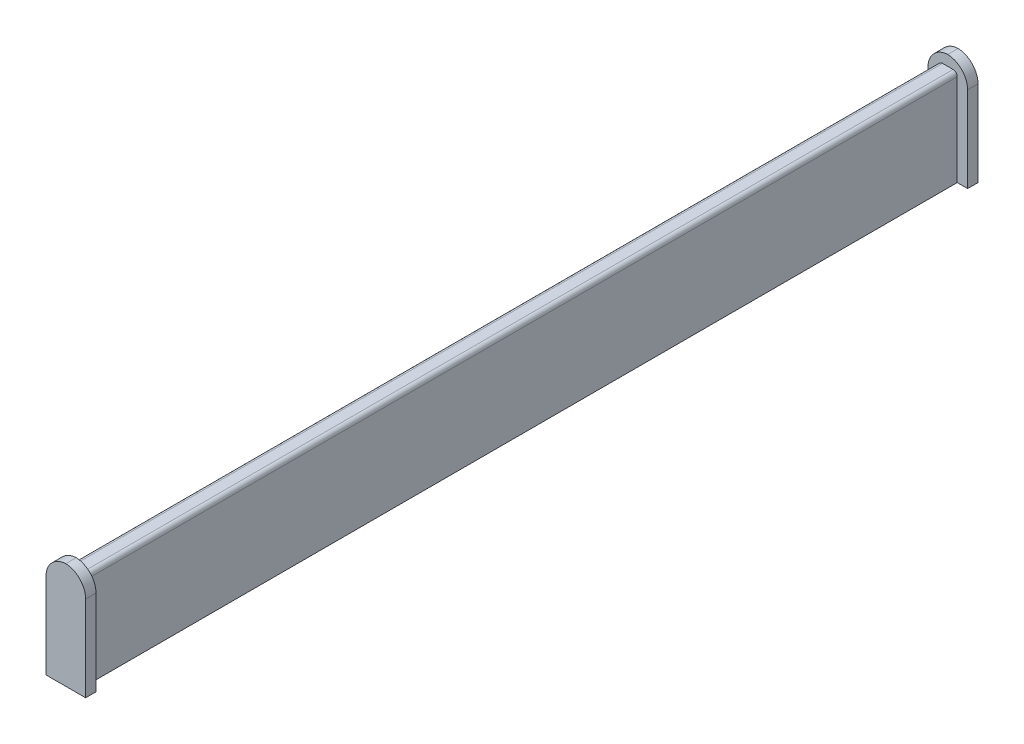
ISO-10303-21;
HEADER;
FILE_DESCRIPTION(('STEP AP214'),'2;1');
FILE_NAME('part.step','',(''),(''),'','','');
FILE_SCHEMA(('AUTOMOTIVE_DESIGN { 1 0 10303 214 1 1 1 1 }'));
ENDSEC;
DATA;
#1=APPLICATION_CONTEXT('core data for automotive mechanical design processes');
#2=APPLICATION_PROTOCOL_DEFINITION('international standard','automotive_design',2000,#1);
#3=PRODUCT_CONTEXT('',#1,'mechanical');
#4=PRODUCT('Part','Part','',(#3));
#5=PRODUCT_RELATED_PRODUCT_CATEGORY('part','',(#4));
#6=PRODUCT_DEFINITION_FORMATION('','',#4);
#7=PRODUCT_DEFINITION_CONTEXT('part definition',#1,'design');
#8=PRODUCT_DEFINITION('design','',#6,#7);
#9=PRODUCT_DEFINITION_SHAPE('','',#8);
#10=(LENGTH_UNIT() NAMED_UNIT(*) SI_UNIT(.MILLI.,.METRE.));
#11=(NAMED_UNIT(*) PLANE_ANGLE_UNIT() SI_UNIT($,.RADIAN.));
#12=(NAMED_UNIT(*) SI_UNIT($,.STERADIAN.) SOLID_ANGLE_UNIT());
#13=UNCERTAINTY_MEASURE_WITH_UNIT(LENGTH_MEASURE(1.E-05),#10,'distance_accuracy_value','');
#14=(GEOMETRIC_REPRESENTATION_CONTEXT(3) GLOBAL_UNCERTAINTY_ASSIGNED_CONTEXT((#13)) GLOBAL_UNIT_ASSIGNED_CONTEXT((#10,
#11,#12)) REPRESENTATION_CONTEXT('',''));
#15=CARTESIAN_POINT('',(0.,0.,0.));
#16=DIRECTION('',(0.,0.,1.));
#17=DIRECTION('',(1.,0.,0.));
#18=AXIS2_PLACEMENT_3D('',#15,#16,#17);
#19=CARTESIAN_POINT('',(3.032125,1.905,133.35));
#20=DIRECTION('',(1.,0.,0.));
#21=DIRECTION('',(0.,0.,-1.));
#22=AXIS2_PLACEMENT_3D('',#19,#20,#21);
#23=PLANE('',#22);
#24=DIRECTION('',(0.,-1.,0.));
#25=VECTOR('',#24,1.);
#26=CARTESIAN_POINT('',(3.032125,1.905,0.));
#27=LINE('',#26,#25);
#28=CARTESIAN_POINT('',(3.032125,3.032125,0.));
#29=VERTEX_POINT('',#28);
#30=CARTESIAN_POINT('',(3.032125,-11.007125052,0.));
#31=VERTEX_POINT('',#30);
#32=EDGE_CURVE('E226',#29,#31,#27,.T.);
#33=ORIENTED_EDGE('',*,*,#32,.F.);
#34=DIRECTION('',(0.,0.,-1.));
#35=VECTOR('',#34,1.);
#36=CARTESIAN_POINT('',(3.032125,3.032125,133.35));
#37=LINE('',#36,#35);
#38=CARTESIAN_POINT('',(3.032125,3.032125,133.35));
#39=VERTEX_POINT('',#38);
#40=EDGE_CURVE('E52',#29,#39,#37,.F.);
#41=ORIENTED_EDGE('',*,*,#40,.T.);
#42=DIRECTION('',(0.,-1.,0.));
#43=VECTOR('',#42,1.);
#44=CARTESIAN_POINT('',(3.032125,3.667125,133.35));
#45=LINE('',#44,#43);
#46=CARTESIAN_POINT('',(3.032125,-11.007125052,133.35));
#47=VERTEX_POINT('',#46);
#48=EDGE_CURVE('E229',#39,#47,#45,.T.);
#49=ORIENTED_EDGE('',*,*,#48,.T.);
#50=DIRECTION('',(0.,0.,1.));
#51=VECTOR('',#50,1.);
#52=CARTESIAN_POINT('',(3.032125,-11.007125052,133.35));
#53=LINE('',#52,#51);
#54=EDGE_CURVE('E194',#31,#47,#53,.T.);
#55=ORIENTED_EDGE('',*,*,#54,.F.);
#56=EDGE_LOOP('',(#33,#41,#49,#55));
#57=FACE_BOUND('',#56,.T.);
#58=ADVANCED_FACE('F37',(#57),#23,.T.);
#59=CARTESIAN_POINT('',(0.142874999999999,3.667125,133.35));
#60=DIRECTION('',(0.,1.,0.));
#61=DIRECTION('',(0.,0.,1.));
#62=AXIS2_PLACEMENT_3D('',#59,#60,#61);
#63=PLANE('',#62);
#64=DIRECTION('',(1.,0.,0.));
#65=VECTOR('',#64,1.);
#66=CARTESIAN_POINT('',(0.142874999999999,3.667125,0.));
#67=LINE('',#66,#65);
#68=CARTESIAN_POINT('',(0.777874999999999,3.667125,0.));
#69=VERTEX_POINT('',#68);
#70=CARTESIAN_POINT('',(2.397125,3.667125,0.));
#71=VERTEX_POINT('',#70);
#72=EDGE_CURVE('E232',#69,#71,#67,.T.);
#73=ORIENTED_EDGE('',*,*,#72,.F.);
#74=DIRECTION('',(0.,0.,-1.));
#75=VECTOR('',#74,1.);
#76=CARTESIAN_POINT('',(0.777874999999999,3.667125,133.35));
#77=LINE('',#76,#75);
#78=CARTESIAN_POINT('',(0.777874999999999,3.667125,133.35));
#79=VERTEX_POINT('',#78);
#80=EDGE_CURVE('E269',#69,#79,#77,.F.);
#81=ORIENTED_EDGE('',*,*,#80,.T.);
#82=DIRECTION('',(1.,0.,0.));
#83=VECTOR('',#82,1.);
#84=CARTESIAN_POINT('',(0.142874999999999,3.667125,133.35));
#85=LINE('',#84,#83);
#86=CARTESIAN_POINT('',(2.397125,3.667125,133.35));
#87=VERTEX_POINT('',#86);
#88=EDGE_CURVE('E225',#79,#87,#85,.T.);
#89=ORIENTED_EDGE('',*,*,#88,.T.);
#90=DIRECTION('',(0.,0.,-1.));
#91=VECTOR('',#90,1.);
#92=CARTESIAN_POINT('',(2.397125,3.667125,133.35));
#93=LINE('',#92,#91);
#94=EDGE_CURVE('E266',#87,#71,#93,.T.);
#95=ORIENTED_EDGE('',*,*,#94,.T.);
#96=EDGE_LOOP('',(#73,#81,#89,#95));
#97=FACE_BOUND('',#96,.T.);
#98=ADVANCED_FACE('F288',(#97),#63,.T.);
#99=CARTESIAN_POINT('',(0.142874999999999,3.667125,133.35));
#100=DIRECTION('',(1.,0.,0.));
#101=DIRECTION('',(0.,1.,0.));
#102=AXIS2_PLACEMENT_3D('',#99,#100,#101);
#103=PLANE('',#102);
#104=DIRECTION('',(0.,1.,0.));
#105=VECTOR('',#104,1.);
#106=CARTESIAN_POINT('',(0.142875,0.142875,133.35));
#107=LINE('',#106,#105);
#108=CARTESIAN_POINT('',(0.142875000000001,-11.007125052,133.35));
#109=VERTEX_POINT('',#108);
#110=CARTESIAN_POINT('',(0.142874999999999,3.032125,133.35));
#111=VERTEX_POINT('',#110);
#112=EDGE_CURVE('E165',#109,#111,#107,.T.);
#113=ORIENTED_EDGE('',*,*,#112,.T.);
#114=DIRECTION('',(0.,0.,-1.));
#115=VECTOR('',#114,1.);
#116=CARTESIAN_POINT('',(0.142874999999999,3.032125,0.));
#117=LINE('',#116,#115);
#118=CARTESIAN_POINT('',(0.142874999999999,3.032125,0.));
#119=VERTEX_POINT('',#118);
#120=EDGE_CURVE('E261',#111,#119,#117,.T.);
#121=ORIENTED_EDGE('',*,*,#120,.T.);
#122=DIRECTION('',(0.,-1.,0.));
#123=VECTOR('',#122,1.);
#124=CARTESIAN_POINT('',(0.142874999999999,3.667125,0.));
#125=LINE('',#124,#123);
#126=CARTESIAN_POINT('',(0.142875000000001,-11.007125052,0.));
#127=VERTEX_POINT('',#126);
#128=EDGE_CURVE('E221',#119,#127,#125,.T.);
#129=ORIENTED_EDGE('',*,*,#128,.T.);
#130=DIRECTION('',(0.,0.,-1.));
#131=VECTOR('',#130,1.);
#132=CARTESIAN_POINT('',(0.142875000000001,-11.007125052,0.));
#133=LINE('',#132,#131);
#134=EDGE_CURVE('E169',#109,#127,#133,.T.);
#135=ORIENTED_EDGE('',*,*,#134,.F.);
#136=EDGE_LOOP('',(#113,#121,#129,#135));
#137=FACE_BOUND('',#136,.T.);
#138=ADVANCED_FACE('F281',(#137),#103,.F.);
#139=CARTESIAN_POINT('',(-1.444625,0.142875,134.9375));
#140=DIRECTION('',(-1.,0.,0.));
#141=DIRECTION('',(0.,0.,1.));
#142=AXIS2_PLACEMENT_3D('',#139,#140,#141);
#143=PLANE('',#142);
#144=DIRECTION('',(0.,1.,0.));
#145=VECTOR('',#144,1.);
#146=CARTESIAN_POINT('',(-1.444625,0.142875,134.9375));
#147=LINE('',#146,#145);
#148=CARTESIAN_POINT('',(-1.444625,-11.007125052,134.9375));
#149=VERTEX_POINT('',#148);
#150=CARTESIAN_POINT('',(-1.444625,2.079625,134.9375));
#151=VERTEX_POINT('',#150);
#152=EDGE_CURVE('E219',#149,#151,#147,.T.);
#153=ORIENTED_EDGE('',*,*,#152,.T.);
#154=DIRECTION('',(0.,0.,-1.));
#155=VECTOR('',#154,1.);
#156=CARTESIAN_POINT('',(-1.444625,2.079625,134.9375));
#157=LINE('',#156,#155);
#158=CARTESIAN_POINT('',(-1.444625,2.079625,133.35));
#159=VERTEX_POINT('',#158);
#160=EDGE_CURVE('E156',#151,#159,#157,.T.);
#161=ORIENTED_EDGE('',*,*,#160,.T.);
#162=DIRECTION('',(0.,1.,0.));
#163=VECTOR('',#162,1.);
#164=CARTESIAN_POINT('',(-1.444625,0.142875,133.35));
#165=LINE('',#164,#163);
#166=CARTESIAN_POINT('',(-1.444625,-11.007125052,133.35));
#167=VERTEX_POINT('',#166);
#168=EDGE_CURVE('E149',#167,#159,#165,.T.);
#169=ORIENTED_EDGE('',*,*,#168,.F.);
#170=DIRECTION('',(0.,0.,-1.));
#171=VECTOR('',#170,1.);
#172=CARTESIAN_POINT('',(-1.444625,-11.007125052,133.35));
#173=LINE('',#172,#171);
#174=EDGE_CURVE('E154',#149,#167,#173,.T.);
#175=ORIENTED_EDGE('',*,*,#174,.F.);
#176=EDGE_LOOP('',(#153,#161,#169,#175));
#177=FACE_BOUND('',#176,.T.);
#178=ADVANCED_FACE('F152',(#177),#143,.T.);
#179=CARTESIAN_POINT('',(4.619625,0.142875,134.9375));
#180=DIRECTION('',(-1.,0.,0.));
#181=DIRECTION('',(0.,0.,1.));
#182=AXIS2_PLACEMENT_3D('',#179,#180,#181);
#183=PLANE('',#182);
#184=DIRECTION('',(0.,1.,0.));
#185=VECTOR('',#184,1.);
#186=CARTESIAN_POINT('',(4.619625,0.142875,133.35));
#187=LINE('',#186,#185);
#188=CARTESIAN_POINT('',(4.619625,-11.007125052,133.35));
#189=VERTEX_POINT('',#188);
#190=CARTESIAN_POINT('',(4.619625,2.079625,133.35));
#191=VERTEX_POINT('',#190);
#192=EDGE_CURVE('E159',#189,#191,#187,.T.);
#193=ORIENTED_EDGE('',*,*,#192,.T.);
#194=DIRECTION('',(0.,0.,-1.));
#195=VECTOR('',#194,1.);
#196=CARTESIAN_POINT('',(4.619625,2.079625,134.9375));
#197=LINE('',#196,#195);
#198=CARTESIAN_POINT('',(4.619625,2.079625,134.9375));
#199=VERTEX_POINT('',#198);
#200=EDGE_CURVE('E244',#191,#199,#197,.F.);
#201=ORIENTED_EDGE('',*,*,#200,.T.);
#202=DIRECTION('',(0.,1.,0.));
#203=VECTOR('',#202,1.);
#204=CARTESIAN_POINT('',(4.619625,0.142875,134.9375));
#205=LINE('',#204,#203);
#206=CARTESIAN_POINT('',(4.619625,-11.007125052,134.9375));
#207=VERTEX_POINT('',#206);
#208=EDGE_CURVE('E158',#207,#199,#205,.T.);
#209=ORIENTED_EDGE('',*,*,#208,.F.);
#210=DIRECTION('',(0.,0.,1.));
#211=VECTOR('',#210,1.);
#212=CARTESIAN_POINT('',(4.619625,-11.007125052,134.9375));
#213=LINE('',#212,#211);
#214=EDGE_CURVE('E200',#189,#207,#213,.T.);
#215=ORIENTED_EDGE('',*,*,#214,.F.);
#216=EDGE_LOOP('',(#193,#201,#209,#215));
#217=FACE_BOUND('',#216,.T.);
#218=ADVANCED_FACE('F337',(#217),#183,.F.);
#219=CARTESIAN_POINT('',(0.,0.,134.9375));
#220=DIRECTION('',(0.,0.,1.));
#221=DIRECTION('',(1.,0.,0.));
#222=AXIS2_PLACEMENT_3D('',#219,#220,#221);
#223=PLANE('',#222);
#224=CARTESIAN_POINT('',(1.444625,2.079625,134.9375));
#225=DIRECTION('',(0.,0.,1.));
#226=DIRECTION('',(1.,0.,0.));
#227=AXIS2_PLACEMENT_3D('',#224,#225,#226);
#228=CIRCLE('',#227,3.175);
#229=CARTESIAN_POINT('',(1.5875,5.25140868341458,134.9375));
#230=VERTEX_POINT('',#229);
#231=EDGE_CURVE('E240',#199,#230,#228,.T.);
#232=ORIENTED_EDGE('',*,*,#231,.T.);
#233=CARTESIAN_POINT('',(1.730375,2.079625,134.9375));
#234=DIRECTION('',(0.,0.,1.));
#235=DIRECTION('',(1.,0.,0.));
#236=AXIS2_PLACEMENT_3D('',#233,#234,#235);
#237=CIRCLE('',#236,3.175);
#238=EDGE_CURVE('E242',#230,#151,#237,.T.);
#239=ORIENTED_EDGE('',*,*,#238,.T.);
#240=ORIENTED_EDGE('',*,*,#152,.F.);
#241=DIRECTION('',(-1.,0.,0.));
#242=VECTOR('',#241,1.);
#243=CARTESIAN_POINT('',(-1.444625,-11.007125052,134.9375));
#244=LINE('',#243,#242);
#245=EDGE_CURVE('E175',#207,#149,#244,.T.);
#246=ORIENTED_EDGE('',*,*,#245,.F.);
#247=ORIENTED_EDGE('',*,*,#208,.T.);
#248=EDGE_LOOP('',(#232,#239,#240,#246,#247));
#249=FACE_BOUND('',#248,.T.);
#250=ADVANCED_FACE('F383',(#249),#223,.T.);
#251=CARTESIAN_POINT('',(0.,0.,133.35));
#252=DIRECTION('',(0.,0.,1.));
#253=DIRECTION('',(1.,0.,0.));
#254=AXIS2_PLACEMENT_3D('',#251,#252,#253);
#255=PLANE('',#254);
#256=ORIENTED_EDGE('',*,*,#168,.T.);
#257=CARTESIAN_POINT('',(1.730375,2.079625,133.35));
#258=DIRECTION('',(0.,0.,1.));
#259=DIRECTION('',(1.,0.,0.));
#260=AXIS2_PLACEMENT_3D('',#257,#258,#259);
#261=CIRCLE('',#260,3.175);
#262=CARTESIAN_POINT('',(1.5875,5.25140868341458,133.35));
#263=VERTEX_POINT('',#262);
#264=EDGE_CURVE('E238',#159,#263,#261,.F.);
#265=ORIENTED_EDGE('',*,*,#264,.T.);
#266=CARTESIAN_POINT('',(1.444625,2.079625,133.35));
#267=DIRECTION('',(0.,0.,1.));
#268=DIRECTION('',(1.,0.,0.));
#269=AXIS2_PLACEMENT_3D('',#266,#267,#268);
#270=CIRCLE('',#269,3.175);
#271=EDGE_CURVE('E236',#263,#191,#270,.F.);
#272=ORIENTED_EDGE('',*,*,#271,.T.);
#273=ORIENTED_EDGE('',*,*,#192,.F.);
#274=DIRECTION('',(1.,0.,0.));
#275=VECTOR('',#274,1.);
#276=CARTESIAN_POINT('',(4.619625,-11.007125052,133.35));
#277=LINE('',#276,#275);
#278=EDGE_CURVE('E197',#47,#189,#277,.T.);
#279=ORIENTED_EDGE('',*,*,#278,.F.);
#280=ORIENTED_EDGE('',*,*,#48,.F.);
#281=CARTESIAN_POINT('',(2.397125,3.032125,133.35));
#282=DIRECTION('',(0.,0.,1.));
#283=DIRECTION('',(1.,0.,0.));
#284=AXIS2_PLACEMENT_3D('',#281,#282,#283);
#285=CIRCLE('',#284,0.635);
#286=EDGE_CURVE('E11',#39,#87,#285,.T.);
#287=ORIENTED_EDGE('',*,*,#286,.T.);
#288=ORIENTED_EDGE('',*,*,#88,.F.);
#289=CARTESIAN_POINT('',(0.777874999999999,3.032125,133.35));
#290=DIRECTION('',(0.,0.,1.));
#291=DIRECTION('',(1.,0.,0.));
#292=AXIS2_PLACEMENT_3D('',#289,#290,#291);
#293=CIRCLE('',#292,0.635);
#294=EDGE_CURVE('E274',#79,#111,#293,.T.);
#295=ORIENTED_EDGE('',*,*,#294,.T.);
#296=ORIENTED_EDGE('',*,*,#112,.F.);
#297=DIRECTION('',(1.,0.,0.));
#298=VECTOR('',#297,1.);
#299=CARTESIAN_POINT('',(0.142875000000001,-11.007125052,133.35));
#300=LINE('',#299,#298);
#301=EDGE_CURVE('E162',#167,#109,#300,.T.);
#302=ORIENTED_EDGE('',*,*,#301,.F.);
#303=EDGE_LOOP('',(#256,#265,#272,#273,#279,#280,#287,#288,#295,#296,#302));
#304=FACE_BOUND('',#303,.T.);
#305=ADVANCED_FACE('F163',(#304),#255,.F.);
#306=CARTESIAN_POINT('',(1.444625,2.079625,134.9375));
#307=DIRECTION('',(0.,0.,1.));
#308=DIRECTION('',(1.,0.,0.));
#309=AXIS2_PLACEMENT_3D('',#306,#307,#308);
#310=CYLINDRICAL_SURFACE('',#309,3.175);
#311=DIRECTION('',(0.,0.,1.));
#312=VECTOR('',#311,1.);
#313=CARTESIAN_POINT('',(1.5875,5.25140868341458,134.14375));
#314=LINE('',#313,#312);
#315=EDGE_CURVE('E211',#230,#263,#314,.F.);
#316=ORIENTED_EDGE('',*,*,#315,.F.);
#317=ORIENTED_EDGE('',*,*,#231,.F.);
#318=ORIENTED_EDGE('',*,*,#200,.F.);
#319=ORIENTED_EDGE('',*,*,#271,.F.);
#320=EDGE_LOOP('',(#316,#317,#318,#319));
#321=FACE_BOUND('',#320,.T.);
#322=ADVANCED_FACE('F324',(#321),#310,.T.);
#323=CARTESIAN_POINT('',(1.730375,2.079625,134.9375));
#324=DIRECTION('',(0.,0.,-1.));
#325=DIRECTION('',(-1.,0.,0.));
#326=AXIS2_PLACEMENT_3D('',#323,#324,#325);
#327=CYLINDRICAL_SURFACE('',#326,3.175);
#328=ORIENTED_EDGE('',*,*,#238,.F.);
#329=ORIENTED_EDGE('',*,*,#315,.T.);
#330=ORIENTED_EDGE('',*,*,#264,.F.);
#331=ORIENTED_EDGE('',*,*,#160,.F.);
#332=EDGE_LOOP('',(#328,#329,#330,#331));
#333=FACE_BOUND('',#332,.T.);
#334=ADVANCED_FACE('F316',(#333),#327,.T.);
#335=CARTESIAN_POINT('',(4.619625,0.142875,-1.5875));
#336=DIRECTION('',(1.,0.,0.));
#337=DIRECTION('',(0.,0.,-1.));
#338=AXIS2_PLACEMENT_3D('',#335,#336,#337);
#339=PLANE('',#338);
#340=DIRECTION('',(0.,1.,0.));
#341=VECTOR('',#340,1.);
#342=CARTESIAN_POINT('',(4.619625,0.142875,-1.5875));
#343=LINE('',#342,#341);
#344=CARTESIAN_POINT('',(4.619625,-11.007125052,-1.5875));
#345=VERTEX_POINT('',#344);
#346=CARTESIAN_POINT('',(4.619625,2.079625,-1.5875));
#347=VERTEX_POINT('',#346);
#348=EDGE_CURVE('E207',#345,#347,#343,.T.);
#349=ORIENTED_EDGE('',*,*,#348,.T.);
#350=DIRECTION('',(0.,0.,1.));
#351=VECTOR('',#350,1.);
#352=CARTESIAN_POINT('',(4.619625,2.079625,0.));
#353=LINE('',#352,#351);
#354=CARTESIAN_POINT('',(4.619625,2.079625,0.));
#355=VERTEX_POINT('',#354);
#356=EDGE_CURVE('E259',#347,#355,#353,.T.);
#357=ORIENTED_EDGE('',*,*,#356,.T.);
#358=DIRECTION('',(0.,1.,0.));
#359=VECTOR('',#358,1.);
#360=CARTESIAN_POINT('',(4.619625,0.142875,0.));
#361=LINE('',#360,#359);
#362=CARTESIAN_POINT('',(4.619625,-11.007125052,0.));
#363=VERTEX_POINT('',#362);
#364=EDGE_CURVE('E208',#363,#355,#361,.T.);
#365=ORIENTED_EDGE('',*,*,#364,.F.);
#366=DIRECTION('',(0.,0.,1.));
#367=VECTOR('',#366,1.);
#368=CARTESIAN_POINT('',(4.619625,-11.007125052,0.));
#369=LINE('',#368,#367);
#370=EDGE_CURVE('E188',#345,#363,#369,.T.);
#371=ORIENTED_EDGE('',*,*,#370,.F.);
#372=EDGE_LOOP('',(#349,#357,#365,#371));
#373=FACE_BOUND('',#372,.T.);
#374=ADVANCED_FACE('F314',(#373),#339,.T.);
#375=CARTESIAN_POINT('',(-1.444625,0.142875,-1.5875));
#376=DIRECTION('',(1.,0.,0.));
#377=DIRECTION('',(0.,0.,-1.));
#378=AXIS2_PLACEMENT_3D('',#375,#376,#377);
#379=PLANE('',#378);
#380=DIRECTION('',(0.,1.,0.));
#381=VECTOR('',#380,1.);
#382=CARTESIAN_POINT('',(-1.444625,0.142875,0.));
#383=LINE('',#382,#381);
#384=CARTESIAN_POINT('',(-1.444625,-11.007125052,0.));
#385=VERTEX_POINT('',#384);
#386=CARTESIAN_POINT('',(-1.444625,2.079625,0.));
#387=VERTEX_POINT('',#386);
#388=EDGE_CURVE('E212',#385,#387,#383,.T.);
#389=ORIENTED_EDGE('',*,*,#388,.T.);
#390=DIRECTION('',(0.,0.,1.));
#391=VECTOR('',#390,1.);
#392=CARTESIAN_POINT('',(-1.444625,2.079625,-1.5875));
#393=LINE('',#392,#391);
#394=CARTESIAN_POINT('',(-1.444625,2.079625,-1.5875));
#395=VERTEX_POINT('',#394);
#396=EDGE_CURVE('E252',#387,#395,#393,.F.);
#397=ORIENTED_EDGE('',*,*,#396,.T.);
#398=DIRECTION('',(0.,1.,0.));
#399=VECTOR('',#398,1.);
#400=CARTESIAN_POINT('',(-1.444625,0.142875,-1.5875));
#401=LINE('',#400,#399);
#402=CARTESIAN_POINT('',(-1.444625,-11.007125052,-1.5875));
#403=VERTEX_POINT('',#402);
#404=EDGE_CURVE('E204',#403,#395,#401,.T.);
#405=ORIENTED_EDGE('',*,*,#404,.F.);
#406=DIRECTION('',(0.,0.,-1.));
#407=VECTOR('',#406,1.);
#408=CARTESIAN_POINT('',(-1.444625,-11.007125052,-1.5875));
#409=LINE('',#408,#407);
#410=EDGE_CURVE('E182',#385,#403,#409,.T.);
#411=ORIENTED_EDGE('',*,*,#410,.F.);
#412=EDGE_LOOP('',(#389,#397,#405,#411));
#413=FACE_BOUND('',#412,.T.);
#414=ADVANCED_FACE('F310',(#413),#379,.F.);
#415=CARTESIAN_POINT('',(0.,0.,-1.5875));
#416=DIRECTION('',(0.,0.,-1.));
#417=DIRECTION('',(1.,0.,0.));
#418=AXIS2_PLACEMENT_3D('',#415,#416,#417);
#419=PLANE('',#418);
#420=ORIENTED_EDGE('',*,*,#404,.T.);
#421=CARTESIAN_POINT('',(1.730375,2.079625,-1.5875));
#422=DIRECTION('',(0.,0.,-1.));
#423=DIRECTION('',(-1.,0.,0.));
#424=AXIS2_PLACEMENT_3D('',#421,#422,#423);
#425=CIRCLE('',#424,3.175);
#426=CARTESIAN_POINT('',(1.5875,5.25140868341458,-1.5875));
#427=VERTEX_POINT('',#426);
#428=EDGE_CURVE('E257',#395,#427,#425,.T.);
#429=ORIENTED_EDGE('',*,*,#428,.T.);
#430=CARTESIAN_POINT('',(1.444625,2.079625,-1.5875));
#431=DIRECTION('',(0.,0.,-1.));
#432=DIRECTION('',(-1.,0.,0.));
#433=AXIS2_PLACEMENT_3D('',#430,#431,#432);
#434=CIRCLE('',#433,3.175);
#435=EDGE_CURVE('E255',#427,#347,#434,.T.);
#436=ORIENTED_EDGE('',*,*,#435,.T.);
#437=ORIENTED_EDGE('',*,*,#348,.F.);
#438=DIRECTION('',(1.,0.,0.));
#439=VECTOR('',#438,1.);
#440=CARTESIAN_POINT('',(4.619625,-11.007125052,-1.5875));
#441=LINE('',#440,#439);
#442=EDGE_CURVE('E185',#403,#345,#441,.T.);
#443=ORIENTED_EDGE('',*,*,#442,.F.);
#444=EDGE_LOOP('',(#420,#429,#436,#437,#443));
#445=FACE_BOUND('',#444,.T.);
#446=ADVANCED_FACE('F313',(#445),#419,.T.);
#447=CARTESIAN_POINT('',(0.,0.,0.));
#448=DIRECTION('',(0.,0.,-1.));
#449=DIRECTION('',(1.,0.,0.));
#450=AXIS2_PLACEMENT_3D('',#447,#448,#449);
#451=PLANE('',#450);
#452=CARTESIAN_POINT('',(1.444625,2.079625,0.));
#453=DIRECTION('',(0.,0.,-1.));
#454=DIRECTION('',(-1.,0.,0.));
#455=AXIS2_PLACEMENT_3D('',#452,#453,#454);
#456=CIRCLE('',#455,3.175);
#457=CARTESIAN_POINT('',(1.5875,5.25140868341458,0.));
#458=VERTEX_POINT('',#457);
#459=EDGE_CURVE('E246',#355,#458,#456,.F.);
#460=ORIENTED_EDGE('',*,*,#459,.T.);
#461=CARTESIAN_POINT('',(1.730375,2.079625,0.));
#462=DIRECTION('',(0.,0.,-1.));
#463=DIRECTION('',(-1.,0.,0.));
#464=AXIS2_PLACEMENT_3D('',#461,#462,#463);
#465=CIRCLE('',#464,3.175);
#466=EDGE_CURVE('E250',#458,#387,#465,.F.);
#467=ORIENTED_EDGE('',*,*,#466,.T.);
#468=ORIENTED_EDGE('',*,*,#388,.F.);
#469=DIRECTION('',(-1.,0.,0.));
#470=VECTOR('',#469,1.);
#471=CARTESIAN_POINT('',(-1.444625,-11.007125052,0.));
#472=LINE('',#471,#470);
#473=EDGE_CURVE('E179',#127,#385,#472,.T.);
#474=ORIENTED_EDGE('',*,*,#473,.F.);
#475=ORIENTED_EDGE('',*,*,#128,.F.);
#476=CARTESIAN_POINT('',(0.777874999999999,3.032125,0.));
#477=DIRECTION('',(0.,0.,-1.));
#478=DIRECTION('',(-1.,0.,0.));
#479=AXIS2_PLACEMENT_3D('',#476,#477,#478);
#480=CIRCLE('',#479,0.635);
#481=EDGE_CURVE('E272',#119,#69,#480,.T.);
#482=ORIENTED_EDGE('',*,*,#481,.T.);
#483=ORIENTED_EDGE('',*,*,#72,.T.);
#484=CARTESIAN_POINT('',(2.397125,3.032125,0.));
#485=DIRECTION('',(0.,0.,-1.));
#486=DIRECTION('',(-1.,0.,0.));
#487=AXIS2_PLACEMENT_3D('',#484,#485,#486);
#488=CIRCLE('',#487,0.635);
#489=EDGE_CURVE('E45',#71,#29,#488,.T.);
#490=ORIENTED_EDGE('',*,*,#489,.T.);
#491=ORIENTED_EDGE('',*,*,#32,.T.);
#492=DIRECTION('',(-1.,0.,0.));
#493=VECTOR('',#492,1.);
#494=CARTESIAN_POINT('',(3.032125,-11.007125052,0.));
#495=LINE('',#494,#493);
#496=EDGE_CURVE('E191',#363,#31,#495,.T.);
#497=ORIENTED_EDGE('',*,*,#496,.F.);
#498=ORIENTED_EDGE('',*,*,#364,.T.);
#499=EDGE_LOOP('',(#460,#467,#468,#474,#475,#482,#483,#490,#491,#497,#498));
#500=FACE_BOUND('',#499,.T.);
#501=ADVANCED_FACE('F285',(#500),#451,.F.);
#502=CARTESIAN_POINT('',(1.444625,2.079625,-1.5875));
#503=DIRECTION('',(0.,0.,-1.));
#504=DIRECTION('',(-1.,0.,0.));
#505=AXIS2_PLACEMENT_3D('',#502,#503,#504);
#506=CYLINDRICAL_SURFACE('',#505,3.175);
#507=ORIENTED_EDGE('',*,*,#356,.F.);
#508=ORIENTED_EDGE('',*,*,#435,.F.);
#509=DIRECTION('',(0.,0.,-1.));
#510=VECTOR('',#509,1.);
#511=CARTESIAN_POINT('',(1.5875,5.25140868341458,-0.79375));
#512=LINE('',#511,#510);
#513=EDGE_CURVE('E203',#458,#427,#512,.T.);
#514=ORIENTED_EDGE('',*,*,#513,.F.);
#515=ORIENTED_EDGE('',*,*,#459,.F.);
#516=EDGE_LOOP('',(#507,#508,#514,#515));
#517=FACE_BOUND('',#516,.T.);
#518=ADVANCED_FACE('F302',(#517),#506,.T.);
#519=CARTESIAN_POINT('',(1.730375,2.079625,-1.5875));
#520=DIRECTION('',(0.,0.,1.));
#521=DIRECTION('',(1.,0.,0.));
#522=AXIS2_PLACEMENT_3D('',#519,#520,#521);
#523=CYLINDRICAL_SURFACE('',#522,3.175);
#524=ORIENTED_EDGE('',*,*,#428,.F.);
#525=ORIENTED_EDGE('',*,*,#396,.F.);
#526=ORIENTED_EDGE('',*,*,#466,.F.);
#527=ORIENTED_EDGE('',*,*,#513,.T.);
#528=EDGE_LOOP('',(#524,#525,#526,#527));
#529=FACE_BOUND('',#528,.T.);
#530=ADVANCED_FACE('F307',(#529),#523,.T.);
#531=CARTESIAN_POINT('',(0.777874999999999,3.032125,133.35));
#532=DIRECTION('',(0.,0.,1.));
#533=DIRECTION('',(1.,0.,0.));
#534=AXIS2_PLACEMENT_3D('',#531,#532,#533);
#535=CYLINDRICAL_SURFACE('',#534,0.635);
#536=ORIENTED_EDGE('',*,*,#294,.F.);
#537=ORIENTED_EDGE('',*,*,#80,.F.);
#538=ORIENTED_EDGE('',*,*,#481,.F.);
#539=ORIENTED_EDGE('',*,*,#120,.F.);
#540=EDGE_LOOP('',(#536,#537,#538,#539));
#541=FACE_BOUND('',#540,.T.);
#542=ADVANCED_FACE('F283',(#541),#535,.T.);
#543=CARTESIAN_POINT('',(2.397125,3.032125,133.35));
#544=DIRECTION('',(0.,0.,-1.));
#545=DIRECTION('',(-1.,0.,0.));
#546=AXIS2_PLACEMENT_3D('',#543,#544,#545);
#547=CYLINDRICAL_SURFACE('',#546,0.635);
#548=ORIENTED_EDGE('',*,*,#286,.F.);
#549=ORIENTED_EDGE('',*,*,#40,.F.);
#550=ORIENTED_EDGE('',*,*,#489,.F.);
#551=ORIENTED_EDGE('',*,*,#94,.F.);
#552=EDGE_LOOP('',(#548,#549,#550,#551));
#553=FACE_BOUND('',#552,.T.);
#554=ADVANCED_FACE('F39',(#553),#547,.T.);
#555=CARTESIAN_POINT('',(0.,-11.007125052,0.));
#556=DIRECTION('',(0.,1.,0.));
#557=DIRECTION('',(-1.,0.,0.));
#558=AXIS2_PLACEMENT_3D('',#555,#556,#557);
#559=PLANE('',#558);
#560=ORIENTED_EDGE('',*,*,#174,.T.);
#561=ORIENTED_EDGE('',*,*,#301,.T.);
#562=ORIENTED_EDGE('',*,*,#134,.T.);
#563=ORIENTED_EDGE('',*,*,#473,.T.);
#564=ORIENTED_EDGE('',*,*,#410,.T.);
#565=ORIENTED_EDGE('',*,*,#442,.T.);
#566=ORIENTED_EDGE('',*,*,#370,.T.);
#567=ORIENTED_EDGE('',*,*,#496,.T.);
#568=ORIENTED_EDGE('',*,*,#54,.T.);
#569=ORIENTED_EDGE('',*,*,#278,.T.);
#570=ORIENTED_EDGE('',*,*,#214,.T.);
#571=ORIENTED_EDGE('',*,*,#245,.T.);
#572=EDGE_LOOP('',(#560,#561,#562,#563,#564,#565,#566,#567,#568,#569,#570,#571));
#573=FACE_BOUND('',#572,.T.);
#574=ADVANCED_FACE('F172',(#573),#559,.F.);
#575=CLOSED_SHELL('',(#58,#98,#138,#178,#218,#250,#305,#322,#334,#374,#414,#446,#501,#518,#530,
#542,#554,#574));
#576=MANIFOLD_SOLID_BREP('B2',#575);
#577=ADVANCED_BREP_SHAPE_REPRESENTATION('',(#18,#576),#14);
#578=SHAPE_DEFINITION_REPRESENTATION(#9,#577);
ENDSEC;
END-ISO-10303-21;
